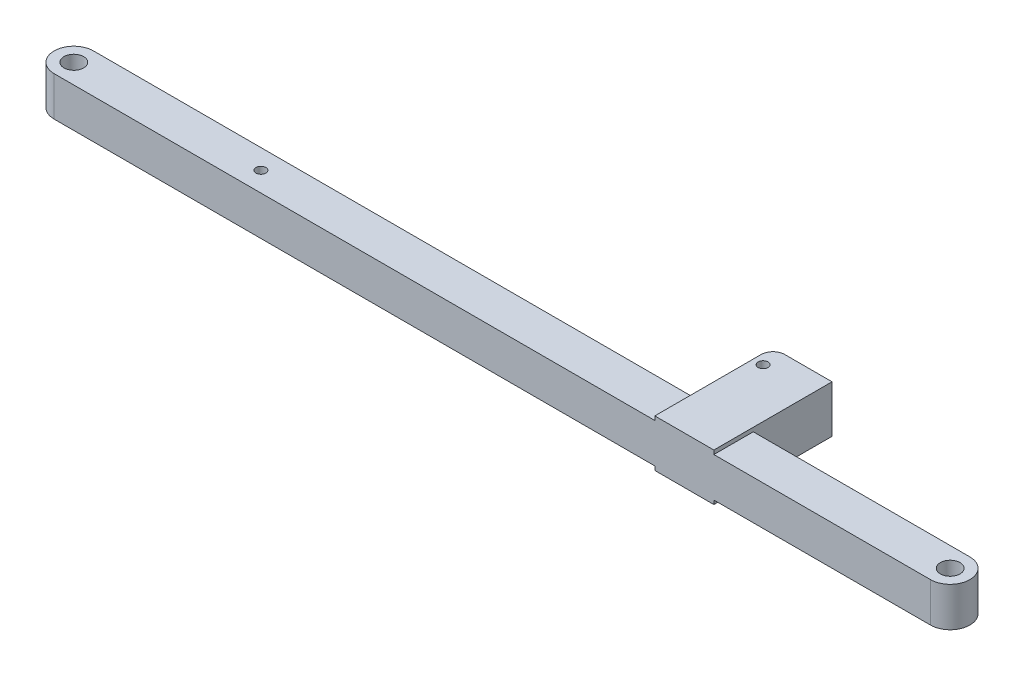
ISO-10303-21;
HEADER;
FILE_DESCRIPTION(('STEP AP214'),'2;1');
FILE_NAME('part.step','',(''),(''),'','','');
FILE_SCHEMA(('AUTOMOTIVE_DESIGN { 1 0 10303 214 1 1 1 1 }'));
ENDSEC;
DATA;
#1=APPLICATION_CONTEXT('core data for automotive mechanical design processes');
#2=APPLICATION_PROTOCOL_DEFINITION('international standard','automotive_design',2000,#1);
#3=PRODUCT_CONTEXT('',#1,'mechanical');
#4=PRODUCT('Part','Part','',(#3));
#5=PRODUCT_RELATED_PRODUCT_CATEGORY('part','',(#4));
#6=PRODUCT_DEFINITION_FORMATION('','',#4);
#7=PRODUCT_DEFINITION_CONTEXT('part definition',#1,'design');
#8=PRODUCT_DEFINITION('design','',#6,#7);
#9=PRODUCT_DEFINITION_SHAPE('','',#8);
#10=(LENGTH_UNIT() NAMED_UNIT(*) SI_UNIT(.MILLI.,.METRE.));
#11=(NAMED_UNIT(*) PLANE_ANGLE_UNIT() SI_UNIT($,.RADIAN.));
#12=(NAMED_UNIT(*) SI_UNIT($,.STERADIAN.) SOLID_ANGLE_UNIT());
#13=UNCERTAINTY_MEASURE_WITH_UNIT(LENGTH_MEASURE(1.E-05),#10,'distance_accuracy_value','');
#14=(GEOMETRIC_REPRESENTATION_CONTEXT(3) GLOBAL_UNCERTAINTY_ASSIGNED_CONTEXT((#13)) GLOBAL_UNIT_ASSIGNED_CONTEXT((#10,
#11,#12)) REPRESENTATION_CONTEXT('',''));
#15=CARTESIAN_POINT('',(0.,0.,0.));
#16=DIRECTION('',(0.,0.,1.));
#17=DIRECTION('',(1.,0.,0.));
#18=AXIS2_PLACEMENT_3D('',#15,#16,#17);
#19=CARTESIAN_POINT('',(0.,-2.53999999999998,0.));
#20=DIRECTION('',(0.,-1.,0.));
#21=DIRECTION('',(0.,0.,-1.));
#22=AXIS2_PLACEMENT_3D('',#19,#20,#21);
#23=PLANE('',#22);
#24=DIRECTION('',(0.,0.,-1.));
#25=VECTOR('',#24,1.);
#26=CARTESIAN_POINT('',(387.35,-2.53999999999998,0.));
#27=LINE('',#26,#25);
#28=CARTESIAN_POINT('',(387.35,-2.53999999999998,0.));
#29=VERTEX_POINT('',#28);
#30=CARTESIAN_POINT('',(387.35,-2.53999999999998,-68.58));
#31=VERTEX_POINT('',#30);
#32=EDGE_CURVE('E243',#29,#31,#27,.T.);
#33=ORIENTED_EDGE('',*,*,#32,.T.);
#34=CARTESIAN_POINT('',(394.97,-2.53999999999998,-68.58));
#35=DIRECTION('',(0.,-1.,0.));
#36=DIRECTION('',(0.,0.,-1.));
#37=AXIS2_PLACEMENT_3D('',#34,#35,#36);
#38=CIRCLE('',#37,7.62);
#39=CARTESIAN_POINT('',(394.97,-2.53999999999998,-76.2));
#40=VERTEX_POINT('',#39);
#41=EDGE_CURVE('E325',#31,#40,#38,.T.);
#42=ORIENTED_EDGE('',*,*,#41,.T.);
#43=DIRECTION('',(-1.,0.,0.));
#44=VECTOR('',#43,1.);
#45=CARTESIAN_POINT('',(0.,-2.53999999999998,-76.2));
#46=LINE('',#45,#44);
#47=CARTESIAN_POINT('',(425.45,-2.53999999999998,-76.2));
#48=VERTEX_POINT('',#47);
#49=EDGE_CURVE('E205',#48,#40,#46,.T.);
#50=ORIENTED_EDGE('',*,*,#49,.F.);
#51=DIRECTION('',(0.,0.,-1.));
#52=VECTOR('',#51,1.);
#53=CARTESIAN_POINT('',(425.45,-2.53999999999998,0.));
#54=LINE('',#53,#52);
#55=CARTESIAN_POINT('',(425.45,-2.53999999999998,0.));
#56=VERTEX_POINT('',#55);
#57=EDGE_CURVE('E236',#56,#48,#54,.T.);
#58=ORIENTED_EDGE('',*,*,#57,.F.);
#59=DIRECTION('',(-1.,0.,0.));
#60=VECTOR('',#59,1.);
#61=CARTESIAN_POINT('',(0.,-2.53999999999998,0.));
#62=LINE('',#61,#60);
#63=EDGE_CURVE('E226',#56,#29,#62,.T.);
#64=ORIENTED_EDGE('',*,*,#63,.T.);
#65=EDGE_LOOP('',(#33,#42,#50,#58,#64));
#66=FACE_BOUND('',#65,.T.);
#67=CARTESIAN_POINT('',(393.7,-2.53999999999998,-63.5));
#68=DIRECTION('',(0.,-1.,0.));
#69=DIRECTION('',(0.,0.,-1.));
#70=AXIS2_PLACEMENT_3D('',#67,#68,#69);
#71=CIRCLE('',#70,3.17499999999997);
#72=CARTESIAN_POINT('',(393.7,-2.53999999999998,-66.675));
#73=VERTEX_POINT('',#72);
#74=EDGE_CURVE('E198',#73,#73,#71,.F.);
#75=ORIENTED_EDGE('',*,*,#74,.T.);
#76=EDGE_LOOP('',(#75));
#77=FACE_BOUND('',#76,.T.);
#78=ADVANCED_FACE('F39',(#66,#77),#23,.T.);
#79=CARTESIAN_POINT('',(0.,27.9400000000001,0.));
#80=DIRECTION('',(0.,1.,0.));
#81=DIRECTION('',(-1.,0.,0.));
#82=AXIS2_PLACEMENT_3D('',#79,#80,#81);
#83=PLANE('',#82);
#84=DIRECTION('',(1.,0.,0.));
#85=VECTOR('',#84,1.);
#86=CARTESIAN_POINT('',(0.,27.9400000000001,-76.2));
#87=LINE('',#86,#85);
#88=CARTESIAN_POINT('',(394.97,27.94,-76.2));
#89=VERTEX_POINT('',#88);
#90=CARTESIAN_POINT('',(425.45,27.94,-76.2));
#91=VERTEX_POINT('',#90);
#92=EDGE_CURVE('E185',#89,#91,#87,.T.);
#93=ORIENTED_EDGE('',*,*,#92,.F.);
#94=CARTESIAN_POINT('',(394.97,27.94,-68.58));
#95=DIRECTION('',(0.,1.,0.));
#96=DIRECTION('',(-1.,0.,0.));
#97=AXIS2_PLACEMENT_3D('',#94,#95,#96);
#98=CIRCLE('',#97,7.62);
#99=CARTESIAN_POINT('',(387.35,27.94,-68.58));
#100=VERTEX_POINT('',#99);
#101=EDGE_CURVE('E61',#89,#100,#98,.T.);
#102=ORIENTED_EDGE('',*,*,#101,.T.);
#103=DIRECTION('',(0.,0.,-1.));
#104=VECTOR('',#103,1.);
#105=CARTESIAN_POINT('',(387.35,27.94,0.));
#106=LINE('',#105,#104);
#107=CARTESIAN_POINT('',(387.35,27.94,0.));
#108=VERTEX_POINT('',#107);
#109=EDGE_CURVE('E241',#108,#100,#106,.T.);
#110=ORIENTED_EDGE('',*,*,#109,.F.);
#111=DIRECTION('',(1.,0.,0.));
#112=VECTOR('',#111,1.);
#113=CARTESIAN_POINT('',(0.,27.9400000000001,0.));
#114=LINE('',#113,#112);
#115=CARTESIAN_POINT('',(425.45,27.94,0.));
#116=VERTEX_POINT('',#115);
#117=EDGE_CURVE('E233',#108,#116,#114,.T.);
#118=ORIENTED_EDGE('',*,*,#117,.T.);
#119=DIRECTION('',(0.,0.,-1.));
#120=VECTOR('',#119,1.);
#121=CARTESIAN_POINT('',(425.45,27.94,0.));
#122=LINE('',#121,#120);
#123=EDGE_CURVE('E237',#116,#91,#122,.T.);
#124=ORIENTED_EDGE('',*,*,#123,.T.);
#125=EDGE_LOOP('',(#93,#102,#110,#118,#124));
#126=FACE_BOUND('',#125,.T.);
#127=CARTESIAN_POINT('',(393.7,27.94,-63.5));
#128=DIRECTION('',(0.,1.,0.));
#129=DIRECTION('',(-1.,0.,0.));
#130=AXIS2_PLACEMENT_3D('',#127,#128,#129);
#131=CIRCLE('',#130,3.17499999999997);
#132=CARTESIAN_POINT('',(390.525,27.94,-63.5));
#133=VERTEX_POINT('',#132);
#134=EDGE_CURVE('E438',#133,#133,#131,.F.);
#135=ORIENTED_EDGE('',*,*,#134,.T.);
#136=EDGE_LOOP('',(#135));
#137=FACE_BOUND('',#136,.T.);
#138=ADVANCED_FACE('F362',(#126,#137),#83,.T.);
#139=CARTESIAN_POINT('',(0.,21.59,-76.2));
#140=DIRECTION('',(0.,1.,0.));
#141=DIRECTION('',(0.,0.,1.));
#142=AXIS2_PLACEMENT_3D('',#139,#140,#141);
#143=PLANE('',#142);
#144=DIRECTION('',(0.,0.,1.));
#145=VECTOR('',#144,1.);
#146=CARTESIAN_POINT('',(387.35,21.59,-76.2));
#147=LINE('',#146,#145);
#148=CARTESIAN_POINT('',(387.35,21.59,-68.58));
#149=VERTEX_POINT('',#148);
#150=CARTESIAN_POINT('',(387.35,21.59,-25.4));
#151=VERTEX_POINT('',#150);
#152=EDGE_CURVE('E175',#149,#151,#147,.T.);
#153=ORIENTED_EDGE('',*,*,#152,.F.);
#154=CARTESIAN_POINT('',(394.97,21.59,-68.58));
#155=DIRECTION('',(0.,1.,0.));
#156=DIRECTION('',(0.,0.,1.));
#157=AXIS2_PLACEMENT_3D('',#154,#155,#156);
#158=CIRCLE('',#157,7.62);
#159=CARTESIAN_POINT('',(394.97,21.59,-76.2));
#160=VERTEX_POINT('',#159);
#161=EDGE_CURVE('E11',#149,#160,#158,.F.);
#162=ORIENTED_EDGE('',*,*,#161,.T.);
#163=DIRECTION('',(-1.,0.,0.));
#164=VECTOR('',#163,1.);
#165=CARTESIAN_POINT('',(0.,21.59,-76.2));
#166=LINE('',#165,#164);
#167=CARTESIAN_POINT('',(419.1,21.59,-76.2));
#168=VERTEX_POINT('',#167);
#169=EDGE_CURVE('E178',#168,#160,#166,.T.);
#170=ORIENTED_EDGE('',*,*,#169,.F.);
#171=DIRECTION('',(0.,0.,1.));
#172=VECTOR('',#171,1.);
#173=CARTESIAN_POINT('',(419.1,21.59,-76.2));
#174=LINE('',#173,#172);
#175=CARTESIAN_POINT('',(419.1,21.59,-25.4));
#176=VERTEX_POINT('',#175);
#177=EDGE_CURVE('E164',#168,#176,#174,.T.);
#178=ORIENTED_EDGE('',*,*,#177,.T.);
#179=DIRECTION('',(-1.,0.,0.));
#180=VECTOR('',#179,1.);
#181=CARTESIAN_POINT('',(0.,21.59,-25.4));
#182=LINE('',#181,#180);
#183=EDGE_CURVE('E210',#176,#151,#182,.T.);
#184=ORIENTED_EDGE('',*,*,#183,.T.);
#185=EDGE_LOOP('',(#153,#162,#170,#178,#184));
#186=FACE_BOUND('',#185,.T.);
#187=CARTESIAN_POINT('',(393.7,21.59,-63.5));
#188=DIRECTION('',(0.,1.,0.));
#189=DIRECTION('',(0.,0.,1.));
#190=AXIS2_PLACEMENT_3D('',#187,#188,#189);
#191=CIRCLE('',#190,3.17499999999997);
#192=CARTESIAN_POINT('',(393.7,21.59,-60.325));
#193=VERTEX_POINT('',#192);
#194=EDGE_CURVE('E317',#193,#193,#191,.F.);
#195=ORIENTED_EDGE('',*,*,#194,.F.);
#196=EDGE_LOOP('',(#195));
#197=FACE_BOUND('',#196,.T.);
#198=ADVANCED_FACE('F179',(#186,#197),#143,.F.);
#199=CARTESIAN_POINT('',(0.,3.81000000000002,-76.2));
#200=DIRECTION('',(0.,1.,0.));
#201=DIRECTION('',(0.,0.,1.));
#202=AXIS2_PLACEMENT_3D('',#199,#200,#201);
#203=PLANE('',#202);
#204=DIRECTION('',(-1.,0.,0.));
#205=VECTOR('',#204,1.);
#206=CARTESIAN_POINT('',(0.,3.81000000000002,-76.2));
#207=LINE('',#206,#205);
#208=CARTESIAN_POINT('',(419.1,3.81000000000002,-76.2));
#209=VERTEX_POINT('',#208);
#210=CARTESIAN_POINT('',(394.97,3.81000000000002,-76.2));
#211=VERTEX_POINT('',#210);
#212=EDGE_CURVE('E191',#209,#211,#207,.T.);
#213=ORIENTED_EDGE('',*,*,#212,.T.);
#214=CARTESIAN_POINT('',(394.97,3.81000000000002,-68.58));
#215=DIRECTION('',(0.,1.,0.));
#216=DIRECTION('',(0.,0.,1.));
#217=AXIS2_PLACEMENT_3D('',#214,#215,#216);
#218=CIRCLE('',#217,7.62);
#219=CARTESIAN_POINT('',(387.35,3.81000000000002,-68.58));
#220=VERTEX_POINT('',#219);
#221=EDGE_CURVE('E321',#211,#220,#218,.T.);
#222=ORIENTED_EDGE('',*,*,#221,.T.);
#223=DIRECTION('',(0.,0.,1.));
#224=VECTOR('',#223,1.);
#225=CARTESIAN_POINT('',(387.35,3.81000000000002,-76.2));
#226=LINE('',#225,#224);
#227=CARTESIAN_POINT('',(387.35,3.81000000000002,-25.4));
#228=VERTEX_POINT('',#227);
#229=EDGE_CURVE('E221',#220,#228,#226,.T.);
#230=ORIENTED_EDGE('',*,*,#229,.T.);
#231=DIRECTION('',(-1.,0.,0.));
#232=VECTOR('',#231,1.);
#233=CARTESIAN_POINT('',(0.,3.81000000000002,-25.4));
#234=LINE('',#233,#232);
#235=CARTESIAN_POINT('',(419.1,3.81000000000002,-25.4));
#236=VERTEX_POINT('',#235);
#237=EDGE_CURVE('E192',#236,#228,#234,.T.);
#238=ORIENTED_EDGE('',*,*,#237,.F.);
#239=DIRECTION('',(0.,0.,1.));
#240=VECTOR('',#239,1.);
#241=CARTESIAN_POINT('',(419.1,3.81000000000002,-76.2));
#242=LINE('',#241,#240);
#243=EDGE_CURVE('E208',#209,#236,#242,.T.);
#244=ORIENTED_EDGE('',*,*,#243,.F.);
#245=EDGE_LOOP('',(#213,#222,#230,#238,#244));
#246=FACE_BOUND('',#245,.T.);
#247=CARTESIAN_POINT('',(393.7,3.81000000000002,-63.5));
#248=DIRECTION('',(0.,1.,0.));
#249=DIRECTION('',(0.,0.,1.));
#250=AXIS2_PLACEMENT_3D('',#247,#248,#249);
#251=CIRCLE('',#250,3.17499999999997);
#252=CARTESIAN_POINT('',(393.7,3.81000000000002,-60.325));
#253=VERTEX_POINT('',#252);
#254=EDGE_CURVE('E314',#253,#253,#251,.F.);
#255=ORIENTED_EDGE('',*,*,#254,.T.);
#256=EDGE_LOOP('',(#255));
#257=FACE_BOUND('',#256,.T.);
#258=ADVANCED_FACE('F339',(#246,#257),#203,.T.);
#259=CARTESIAN_POINT('',(0.,25.4,-25.4));
#260=DIRECTION('',(0.,0.,-1.));
#261=DIRECTION('',(-1.,0.,0.));
#262=AXIS2_PLACEMENT_3D('',#259,#260,#261);
#263=PLANE('',#262);
#264=DIRECTION('',(1.,0.,0.));
#265=VECTOR('',#264,1.);
#266=CARTESIAN_POINT('',(0.,0.,-25.4));
#267=LINE('',#266,#265);
#268=CARTESIAN_POINT('',(425.45,0.,-25.4));
#269=VERTEX_POINT('',#268);
#270=CARTESIAN_POINT('',(565.15,0.,-25.4));
#271=VERTEX_POINT('',#270);
#272=EDGE_CURVE('E279',#269,#271,#267,.T.);
#273=ORIENTED_EDGE('',*,*,#272,.F.);
#274=DIRECTION('',(0.,-1.,0.));
#275=VECTOR('',#274,1.);
#276=CARTESIAN_POINT('',(425.45,0.,-25.4));
#277=LINE('',#276,#275);
#278=CARTESIAN_POINT('',(425.45,25.4,-25.4));
#279=VERTEX_POINT('',#278);
#280=EDGE_CURVE('E215',#279,#269,#277,.T.);
#281=ORIENTED_EDGE('',*,*,#280,.F.);
#282=DIRECTION('',(1.,0.,0.));
#283=VECTOR('',#282,1.);
#284=CARTESIAN_POINT('',(0.,25.4,-25.4));
#285=LINE('',#284,#283);
#286=CARTESIAN_POINT('',(565.15,25.4,-25.4));
#287=VERTEX_POINT('',#286);
#288=EDGE_CURVE('E255',#279,#287,#285,.T.);
#289=ORIENTED_EDGE('',*,*,#288,.T.);
#290=DIRECTION('',(0.,-1.,0.));
#291=VECTOR('',#290,1.);
#292=CARTESIAN_POINT('',(565.15,25.4,-25.4));
#293=LINE('',#292,#291);
#294=EDGE_CURVE('E276',#287,#271,#293,.T.);
#295=ORIENTED_EDGE('',*,*,#294,.T.);
#296=EDGE_LOOP('',(#273,#281,#289,#295));
#297=FACE_BOUND('',#296,.T.);
#298=ADVANCED_FACE('F425',(#297),#263,.T.);
#299=CARTESIAN_POINT('',(0.,25.4,-25.4));
#300=VERTEX_POINT('',#299);
#301=CARTESIAN_POINT('',(387.35,25.4,-25.4));
#302=VERTEX_POINT('',#301);
#303=EDGE_CURVE('E257',#300,#302,#285,.T.);
#304=ORIENTED_EDGE('',*,*,#303,.T.);
#305=DIRECTION('',(0.,1.,0.));
#306=VECTOR('',#305,1.);
#307=CARTESIAN_POINT('',(387.35,0.,-25.4));
#308=LINE('',#307,#306);
#309=EDGE_CURVE('E212',#151,#302,#308,.T.);
#310=ORIENTED_EDGE('',*,*,#309,.F.);
#311=ORIENTED_EDGE('',*,*,#183,.F.);
#312=DIRECTION('',(0.,-1.,0.));
#313=VECTOR('',#312,1.);
#314=CARTESIAN_POINT('',(419.1,0.,-25.4));
#315=LINE('',#314,#313);
#316=EDGE_CURVE('E171',#176,#236,#315,.T.);
#317=ORIENTED_EDGE('',*,*,#316,.T.);
#318=ORIENTED_EDGE('',*,*,#237,.T.);
#319=DIRECTION('',(0.,1.,0.));
#320=VECTOR('',#319,1.);
#321=CARTESIAN_POINT('',(387.35,0.,-25.4));
#322=LINE('',#321,#320);
#323=CARTESIAN_POINT('',(387.35,0.,-25.4));
#324=VERTEX_POINT('',#323);
#325=EDGE_CURVE('E195',#324,#228,#322,.T.);
#326=ORIENTED_EDGE('',*,*,#325,.F.);
#327=CARTESIAN_POINT('',(0.,0.,-25.4));
#328=VERTEX_POINT('',#327);
#329=EDGE_CURVE('E280',#328,#324,#267,.T.);
#330=ORIENTED_EDGE('',*,*,#329,.F.);
#331=DIRECTION('',(0.,-1.,0.));
#332=VECTOR('',#331,1.);
#333=CARTESIAN_POINT('',(0.,25.4,-25.4));
#334=LINE('',#333,#332);
#335=EDGE_CURVE('E306',#300,#328,#334,.T.);
#336=ORIENTED_EDGE('',*,*,#335,.F.);
#337=EDGE_LOOP('',(#304,#310,#311,#317,#318,#326,#330,#336));
#338=FACE_BOUND('',#337,.T.);
#339=ADVANCED_FACE('F347',(#338),#263,.T.);
#340=CARTESIAN_POINT('',(0.,25.4,0.));
#341=DIRECTION('',(0.,1.,0.));
#342=DIRECTION('',(0.,0.,1.));
#343=AXIS2_PLACEMENT_3D('',#340,#341,#342);
#344=PLANE('',#343);
#345=DIRECTION('',(0.,0.,-1.));
#346=VECTOR('',#345,1.);
#347=CARTESIAN_POINT('',(425.45,25.4,0.));
#348=LINE('',#347,#346);
#349=CARTESIAN_POINT('',(425.45,25.4,0.));
#350=VERTEX_POINT('',#349);
#351=EDGE_CURVE('E248',#350,#279,#348,.T.);
#352=ORIENTED_EDGE('',*,*,#351,.F.);
#353=DIRECTION('',(1.,0.,0.));
#354=VECTOR('',#353,1.);
#355=CARTESIAN_POINT('',(0.,25.4,0.));
#356=LINE('',#355,#354);
#357=CARTESIAN_POINT('',(565.15,25.4,0.));
#358=VERTEX_POINT('',#357);
#359=EDGE_CURVE('E263',#350,#358,#356,.T.);
#360=ORIENTED_EDGE('',*,*,#359,.T.);
#361=CARTESIAN_POINT('',(565.15,25.4,-12.7));
#362=DIRECTION('',(0.,1.,0.));
#363=DIRECTION('',(0.,0.,1.));
#364=AXIS2_PLACEMENT_3D('',#361,#362,#363);
#365=CIRCLE('',#364,12.7);
#366=EDGE_CURVE('E267',#287,#358,#365,.F.);
#367=ORIENTED_EDGE('',*,*,#366,.F.);
#368=ORIENTED_EDGE('',*,*,#288,.F.);
#369=EDGE_LOOP('',(#352,#360,#367,#368));
#370=FACE_BOUND('',#369,.T.);
#371=CARTESIAN_POINT('',(565.15,25.4,-12.7));
#372=DIRECTION('',(0.,1.,0.));
#373=DIRECTION('',(0.,0.,1.));
#374=AXIS2_PLACEMENT_3D('',#371,#372,#373);
#375=CIRCLE('',#374,6.34999999999994);
#376=CARTESIAN_POINT('',(565.15,25.4,-6.35000000000006));
#377=VERTEX_POINT('',#376);
#378=EDGE_CURVE('E273',#377,#377,#375,.T.);
#379=ORIENTED_EDGE('',*,*,#378,.F.);
#380=EDGE_LOOP('',(#379));
#381=FACE_BOUND('',#380,.T.);
#382=ADVANCED_FACE('F379',(#370,#381),#344,.T.);
#383=CARTESIAN_POINT('',(0.,0.,0.));
#384=DIRECTION('',(0.,1.,0.));
#385=DIRECTION('',(0.,0.,1.));
#386=AXIS2_PLACEMENT_3D('',#383,#384,#385);
#387=PLANE('',#386);
#388=CARTESIAN_POINT('',(565.15,0.,-12.7));
#389=DIRECTION('',(0.,1.,0.));
#390=DIRECTION('',(0.,0.,1.));
#391=AXIS2_PLACEMENT_3D('',#388,#389,#390);
#392=CIRCLE('',#391,6.34999999999994);
#393=CARTESIAN_POINT('',(565.15,0.,-6.35000000000006));
#394=VERTEX_POINT('',#393);
#395=EDGE_CURVE('E256',#394,#394,#392,.T.);
#396=ORIENTED_EDGE('',*,*,#395,.T.);
#397=EDGE_LOOP('',(#396));
#398=FACE_BOUND('',#397,.T.);
#399=DIRECTION('',(1.,0.,0.));
#400=VECTOR('',#399,1.);
#401=CARTESIAN_POINT('',(0.,0.,0.));
#402=LINE('',#401,#400);
#403=CARTESIAN_POINT('',(425.45,0.,0.));
#404=VERTEX_POINT('',#403);
#405=CARTESIAN_POINT('',(565.15,0.,0.));
#406=VERTEX_POINT('',#405);
#407=EDGE_CURVE('E286',#404,#406,#402,.T.);
#408=ORIENTED_EDGE('',*,*,#407,.F.);
#409=DIRECTION('',(0.,0.,-1.));
#410=VECTOR('',#409,1.);
#411=CARTESIAN_POINT('',(425.45,0.,0.));
#412=LINE('',#411,#410);
#413=EDGE_CURVE('E310',#404,#269,#412,.T.);
#414=ORIENTED_EDGE('',*,*,#413,.T.);
#415=ORIENTED_EDGE('',*,*,#272,.T.);
#416=CARTESIAN_POINT('',(565.15,0.,-12.7));
#417=DIRECTION('',(0.,1.,0.));
#418=DIRECTION('',(0.,0.,1.));
#419=AXIS2_PLACEMENT_3D('',#416,#417,#418);
#420=CIRCLE('',#419,12.7);
#421=EDGE_CURVE('E290',#271,#406,#420,.F.);
#422=ORIENTED_EDGE('',*,*,#421,.T.);
#423=EDGE_LOOP('',(#408,#414,#415,#422));
#424=FACE_BOUND('',#423,.T.);
#425=ADVANCED_FACE('F393',(#398,#424),#387,.F.);
#426=CARTESIAN_POINT('',(0.,25.4,-12.7));
#427=DIRECTION('',(0.,-1.,0.));
#428=DIRECTION('',(0.,0.,-1.));
#429=AXIS2_PLACEMENT_3D('',#426,#427,#428);
#430=CYLINDRICAL_SURFACE('',#429,12.7);
#431=CARTESIAN_POINT('',(0.,0.,-12.7));
#432=DIRECTION('',(0.,1.,0.));
#433=DIRECTION('',(0.,0.,1.));
#434=AXIS2_PLACEMENT_3D('',#431,#432,#433);
#435=CIRCLE('',#434,12.7);
#436=CARTESIAN_POINT('',(0.,0.,0.));
#437=VERTEX_POINT('',#436);
#438=EDGE_CURVE('E283',#328,#437,#435,.T.);
#439=ORIENTED_EDGE('',*,*,#438,.T.);
#440=DIRECTION('',(0.,-1.,0.));
#441=VECTOR('',#440,1.);
#442=CARTESIAN_POINT('',(0.,25.4,0.));
#443=LINE('',#442,#441);
#444=CARTESIAN_POINT('',(0.,25.4,0.));
#445=VERTEX_POINT('',#444);
#446=EDGE_CURVE('E303',#445,#437,#443,.T.);
#447=ORIENTED_EDGE('',*,*,#446,.F.);
#448=CARTESIAN_POINT('',(0.,25.4,-12.7));
#449=DIRECTION('',(0.,1.,0.));
#450=DIRECTION('',(0.,0.,1.));
#451=AXIS2_PLACEMENT_3D('',#448,#449,#450);
#452=CIRCLE('',#451,12.7);
#453=EDGE_CURVE('E260',#300,#445,#452,.T.);
#454=ORIENTED_EDGE('',*,*,#453,.F.);
#455=ORIENTED_EDGE('',*,*,#335,.T.);
#456=EDGE_LOOP('',(#439,#447,#454,#455));
#457=FACE_BOUND('',#456,.T.);
#458=ADVANCED_FACE('F354',(#457),#430,.T.);
#459=CARTESIAN_POINT('',(0.,25.4,0.));
#460=DIRECTION('',(0.,0.,-1.));
#461=DIRECTION('',(-1.,0.,0.));
#462=AXIS2_PLACEMENT_3D('',#459,#460,#461);
#463=PLANE('',#462);
#464=CARTESIAN_POINT('',(387.35,0.,0.));
#465=VERTEX_POINT('',#464);
#466=EDGE_CURVE('E287',#437,#465,#402,.T.);
#467=ORIENTED_EDGE('',*,*,#466,.T.);
#468=DIRECTION('',(0.,1.,0.));
#469=VECTOR('',#468,1.);
#470=CARTESIAN_POINT('',(387.35,0.,0.));
#471=LINE('',#470,#469);
#472=EDGE_CURVE('E230',#29,#465,#471,.T.);
#473=ORIENTED_EDGE('',*,*,#472,.F.);
#474=ORIENTED_EDGE('',*,*,#63,.F.);
#475=DIRECTION('',(0.,-1.,0.));
#476=VECTOR('',#475,1.);
#477=CARTESIAN_POINT('',(425.45,0.,0.));
#478=LINE('',#477,#476);
#479=EDGE_CURVE('E174',#404,#56,#478,.T.);
#480=ORIENTED_EDGE('',*,*,#479,.F.);
#481=ORIENTED_EDGE('',*,*,#407,.T.);
#482=DIRECTION('',(0.,-1.,0.));
#483=VECTOR('',#482,1.);
#484=CARTESIAN_POINT('',(565.15,25.4,0.));
#485=LINE('',#484,#483);
#486=EDGE_CURVE('E300',#358,#406,#485,.T.);
#487=ORIENTED_EDGE('',*,*,#486,.F.);
#488=ORIENTED_EDGE('',*,*,#359,.F.);
#489=EDGE_CURVE('E224',#116,#350,#478,.T.);
#490=ORIENTED_EDGE('',*,*,#489,.F.);
#491=ORIENTED_EDGE('',*,*,#117,.F.);
#492=CARTESIAN_POINT('',(387.35,25.4,0.));
#493=VERTEX_POINT('',#492);
#494=EDGE_CURVE('E229',#493,#108,#471,.T.);
#495=ORIENTED_EDGE('',*,*,#494,.F.);
#496=EDGE_CURVE('E264',#445,#493,#356,.T.);
#497=ORIENTED_EDGE('',*,*,#496,.F.);
#498=ORIENTED_EDGE('',*,*,#446,.T.);
#499=EDGE_LOOP('',(#467,#473,#474,#480,#481,#487,#488,#490,#491,#495,#497,#498));
#500=FACE_BOUND('',#499,.T.);
#501=ADVANCED_FACE('F373',(#500),#463,.F.);
#502=CARTESIAN_POINT('',(120.65,25.4,-12.7));
#503=DIRECTION('',(0.,-1.,0.));
#504=DIRECTION('',(0.,0.,-1.));
#505=AXIS2_PLACEMENT_3D('',#502,#503,#504);
#506=CYLINDRICAL_SURFACE('',#505,3.175);
#507=CARTESIAN_POINT('',(120.65,25.4,-12.7));
#508=DIRECTION('',(0.,1.,0.));
#509=DIRECTION('',(0.,0.,1.));
#510=AXIS2_PLACEMENT_3D('',#507,#508,#509);
#511=CIRCLE('',#510,3.175);
#512=CARTESIAN_POINT('',(120.65,25.4,-9.525));
#513=VERTEX_POINT('',#512);
#514=EDGE_CURVE('E270',#513,#513,#511,.T.);
#515=ORIENTED_EDGE('',*,*,#514,.T.);
#516=EDGE_LOOP('',(#515));
#517=FACE_BOUND('',#516,.T.);
#518=CARTESIAN_POINT('',(120.65,0.,-12.7));
#519=DIRECTION('',(0.,1.,0.));
#520=DIRECTION('',(0.,0.,1.));
#521=AXIS2_PLACEMENT_3D('',#518,#519,#520);
#522=CIRCLE('',#521,3.175);
#523=CARTESIAN_POINT('',(120.65,0.,-9.525));
#524=VERTEX_POINT('',#523);
#525=EDGE_CURVE('E293',#524,#524,#522,.T.);
#526=ORIENTED_EDGE('',*,*,#525,.F.);
#527=EDGE_LOOP('',(#526));
#528=FACE_BOUND('',#527,.T.);
#529=ADVANCED_FACE('F384',(#517,#528),#506,.F.);
#530=CARTESIAN_POINT('',(565.15,25.4,-12.7));
#531=DIRECTION('',(0.,-1.,0.));
#532=DIRECTION('',(0.,0.,-1.));
#533=AXIS2_PLACEMENT_3D('',#530,#531,#532);
#534=CYLINDRICAL_SURFACE('',#533,12.7);
#535=ORIENTED_EDGE('',*,*,#421,.F.);
#536=ORIENTED_EDGE('',*,*,#294,.F.);
#537=ORIENTED_EDGE('',*,*,#366,.T.);
#538=ORIENTED_EDGE('',*,*,#486,.T.);
#539=EDGE_LOOP('',(#535,#536,#537,#538));
#540=FACE_BOUND('',#539,.T.);
#541=ADVANCED_FACE('F387',(#540),#534,.T.);
#542=CARTESIAN_POINT('',(0.,25.4,-12.7));
#543=DIRECTION('',(0.,-1.,0.));
#544=DIRECTION('',(0.,0.,-1.));
#545=AXIS2_PLACEMENT_3D('',#542,#543,#544);
#546=CYLINDRICAL_SURFACE('',#545,6.35);
#547=CARTESIAN_POINT('',(0.,25.4,-12.7));
#548=DIRECTION('',(0.,1.,0.));
#549=DIRECTION('',(0.,0.,1.));
#550=AXIS2_PLACEMENT_3D('',#547,#548,#549);
#551=CIRCLE('',#550,6.35);
#552=CARTESIAN_POINT('',(0.,25.4,-6.35));
#553=VERTEX_POINT('',#552);
#554=EDGE_CURVE('E252',#553,#553,#551,.T.);
#555=ORIENTED_EDGE('',*,*,#554,.T.);
#556=EDGE_LOOP('',(#555));
#557=FACE_BOUND('',#556,.T.);
#558=CARTESIAN_POINT('',(0.,0.,-12.7));
#559=DIRECTION('',(0.,1.,0.));
#560=DIRECTION('',(0.,0.,1.));
#561=AXIS2_PLACEMENT_3D('',#558,#559,#560);
#562=CIRCLE('',#561,6.35);
#563=CARTESIAN_POINT('',(0.,0.,-6.35));
#564=VERTEX_POINT('',#563);
#565=EDGE_CURVE('E251',#564,#564,#562,.T.);
#566=ORIENTED_EDGE('',*,*,#565,.F.);
#567=EDGE_LOOP('',(#566));
#568=FACE_BOUND('',#567,.T.);
#569=ADVANCED_FACE('F452',(#557,#568),#546,.F.);
#570=CARTESIAN_POINT('',(565.15,25.4,-12.7));
#571=DIRECTION('',(0.,-1.,0.));
#572=DIRECTION('',(0.,0.,-1.));
#573=AXIS2_PLACEMENT_3D('',#570,#571,#572);
#574=CYLINDRICAL_SURFACE('',#573,6.34999999999994);
#575=ORIENTED_EDGE('',*,*,#378,.T.);
#576=EDGE_LOOP('',(#575));
#577=FACE_BOUND('',#576,.T.);
#578=ORIENTED_EDGE('',*,*,#395,.F.);
#579=EDGE_LOOP('',(#578));
#580=FACE_BOUND('',#579,.T.);
#581=ADVANCED_FACE('F377',(#577,#580),#574,.F.);
#582=DIRECTION('',(0.,0.,1.));
#583=VECTOR('',#582,1.);
#584=CARTESIAN_POINT('',(387.35,25.4,0.));
#585=LINE('',#584,#583);
#586=EDGE_CURVE('E240',#302,#493,#585,.T.);
#587=ORIENTED_EDGE('',*,*,#586,.F.);
#588=ORIENTED_EDGE('',*,*,#303,.F.);
#589=ORIENTED_EDGE('',*,*,#453,.T.);
#590=ORIENTED_EDGE('',*,*,#496,.T.);
#591=EDGE_LOOP('',(#587,#588,#589,#590));
#592=FACE_BOUND('',#591,.T.);
#593=ORIENTED_EDGE('',*,*,#554,.F.);
#594=EDGE_LOOP('',(#593));
#595=FACE_BOUND('',#594,.T.);
#596=ORIENTED_EDGE('',*,*,#514,.F.);
#597=EDGE_LOOP('',(#596));
#598=FACE_BOUND('',#597,.T.);
#599=ADVANCED_FACE('F374',(#592,#595,#598),#344,.T.);
#600=ORIENTED_EDGE('',*,*,#565,.T.);
#601=EDGE_LOOP('',(#600));
#602=FACE_BOUND('',#601,.T.);
#603=ORIENTED_EDGE('',*,*,#329,.T.);
#604=DIRECTION('',(0.,0.,1.));
#605=VECTOR('',#604,1.);
#606=CARTESIAN_POINT('',(387.35,0.,0.));
#607=LINE('',#606,#605);
#608=EDGE_CURVE('E308',#324,#465,#607,.T.);
#609=ORIENTED_EDGE('',*,*,#608,.T.);
#610=ORIENTED_EDGE('',*,*,#466,.F.);
#611=ORIENTED_EDGE('',*,*,#438,.F.);
#612=EDGE_LOOP('',(#603,#609,#610,#611));
#613=FACE_BOUND('',#612,.T.);
#614=ORIENTED_EDGE('',*,*,#525,.T.);
#615=EDGE_LOOP('',(#614));
#616=FACE_BOUND('',#615,.T.);
#617=ADVANCED_FACE('F350',(#602,#613,#616),#387,.F.);
#618=CARTESIAN_POINT('',(387.35,0.,0.));
#619=DIRECTION('',(-1.,0.,0.));
#620=DIRECTION('',(0.,0.,1.));
#621=AXIS2_PLACEMENT_3D('',#618,#619,#620);
#622=PLANE('',#621);
#623=ORIENTED_EDGE('',*,*,#229,.F.);
#624=DIRECTION('',(0.,1.,0.));
#625=VECTOR('',#624,1.);
#626=CARTESIAN_POINT('',(387.35,0.,-68.58));
#627=LINE('',#626,#625);
#628=EDGE_CURVE('E323',#220,#31,#627,.F.);
#629=ORIENTED_EDGE('',*,*,#628,.T.);
#630=ORIENTED_EDGE('',*,*,#32,.F.);
#631=ORIENTED_EDGE('',*,*,#472,.T.);
#632=ORIENTED_EDGE('',*,*,#608,.F.);
#633=ORIENTED_EDGE('',*,*,#325,.T.);
#634=EDGE_LOOP('',(#623,#629,#630,#631,#632,#633));
#635=FACE_BOUND('',#634,.T.);
#636=ADVANCED_FACE('F343',(#635),#622,.T.);
#637=CARTESIAN_POINT('',(425.45,0.,0.));
#638=DIRECTION('',(1.,0.,0.));
#639=DIRECTION('',(0.,0.,-1.));
#640=AXIS2_PLACEMENT_3D('',#637,#638,#639);
#641=PLANE('',#640);
#642=ORIENTED_EDGE('',*,*,#413,.F.);
#643=ORIENTED_EDGE('',*,*,#479,.T.);
#644=ORIENTED_EDGE('',*,*,#57,.T.);
#645=DIRECTION('',(0.,-1.,0.));
#646=VECTOR('',#645,1.);
#647=CARTESIAN_POINT('',(425.45,0.,-76.2));
#648=LINE('',#647,#646);
#649=EDGE_CURVE('E202',#91,#48,#648,.T.);
#650=ORIENTED_EDGE('',*,*,#649,.F.);
#651=ORIENTED_EDGE('',*,*,#123,.F.);
#652=ORIENTED_EDGE('',*,*,#489,.T.);
#653=ORIENTED_EDGE('',*,*,#351,.T.);
#654=ORIENTED_EDGE('',*,*,#280,.T.);
#655=EDGE_LOOP('',(#642,#643,#644,#650,#651,#652,#653,#654));
#656=FACE_BOUND('',#655,.T.);
#657=ADVANCED_FACE('F368',(#656),#641,.T.);
#658=ORIENTED_EDGE('',*,*,#109,.T.);
#659=DIRECTION('',(0.,1.,0.));
#660=VECTOR('',#659,1.);
#661=CARTESIAN_POINT('',(387.35,0.,-68.58));
#662=LINE('',#661,#660);
#663=EDGE_CURVE('E47',#100,#149,#662,.F.);
#664=ORIENTED_EDGE('',*,*,#663,.T.);
#665=ORIENTED_EDGE('',*,*,#152,.T.);
#666=ORIENTED_EDGE('',*,*,#309,.T.);
#667=ORIENTED_EDGE('',*,*,#586,.T.);
#668=ORIENTED_EDGE('',*,*,#494,.T.);
#669=EDGE_LOOP('',(#658,#664,#665,#666,#667,#668));
#670=FACE_BOUND('',#669,.T.);
#671=ADVANCED_FACE('F359',(#670),#622,.T.);
#672=CARTESIAN_POINT('',(419.1,0.,-76.2));
#673=DIRECTION('',(-1.,0.,0.));
#674=DIRECTION('',(0.,0.,1.));
#675=AXIS2_PLACEMENT_3D('',#672,#673,#674);
#676=PLANE('',#675);
#677=ORIENTED_EDGE('',*,*,#316,.F.);
#678=ORIENTED_EDGE('',*,*,#177,.F.);
#679=DIRECTION('',(0.,-1.,0.));
#680=VECTOR('',#679,1.);
#681=CARTESIAN_POINT('',(419.1,0.,-76.2));
#682=LINE('',#681,#680);
#683=EDGE_CURVE('E169',#168,#209,#682,.T.);
#684=ORIENTED_EDGE('',*,*,#683,.T.);
#685=ORIENTED_EDGE('',*,*,#243,.T.);
#686=EDGE_LOOP('',(#677,#678,#684,#685));
#687=FACE_BOUND('',#686,.T.);
#688=ADVANCED_FACE('F166',(#687),#676,.T.);
#689=CARTESIAN_POINT('',(0.,0.,-76.2));
#690=DIRECTION('',(0.,0.,-1.));
#691=DIRECTION('',(-1.,0.,0.));
#692=AXIS2_PLACEMENT_3D('',#689,#690,#691);
#693=PLANE('',#692);
#694=ORIENTED_EDGE('',*,*,#49,.T.);
#695=DIRECTION('',(0.,1.,0.));
#696=VECTOR('',#695,1.);
#697=CARTESIAN_POINT('',(394.97,0.,-76.2));
#698=LINE('',#697,#696);
#699=EDGE_CURVE('E319',#40,#211,#698,.T.);
#700=ORIENTED_EDGE('',*,*,#699,.T.);
#701=ORIENTED_EDGE('',*,*,#212,.F.);
#702=ORIENTED_EDGE('',*,*,#683,.F.);
#703=ORIENTED_EDGE('',*,*,#169,.T.);
#704=DIRECTION('',(0.,1.,0.));
#705=VECTOR('',#704,1.);
#706=CARTESIAN_POINT('',(394.97,0.,-76.2));
#707=LINE('',#706,#705);
#708=EDGE_CURVE('E313',#160,#89,#707,.T.);
#709=ORIENTED_EDGE('',*,*,#708,.T.);
#710=ORIENTED_EDGE('',*,*,#92,.T.);
#711=ORIENTED_EDGE('',*,*,#649,.T.);
#712=EDGE_LOOP('',(#694,#700,#701,#702,#703,#709,#710,#711));
#713=FACE_BOUND('',#712,.T.);
#714=ADVANCED_FACE('F188',(#713),#693,.T.);
#715=CARTESIAN_POINT('',(393.7,-18.034,-63.5));
#716=DIRECTION('',(0.,1.,0.));
#717=DIRECTION('',(0.,0.,1.));
#718=AXIS2_PLACEMENT_3D('',#715,#716,#717);
#719=CYLINDRICAL_SURFACE('',#718,3.17499999999997);
#720=ORIENTED_EDGE('',*,*,#74,.F.);
#721=EDGE_LOOP('',(#720));
#722=FACE_BOUND('',#721,.T.);
#723=ORIENTED_EDGE('',*,*,#254,.F.);
#724=EDGE_LOOP('',(#723));
#725=FACE_BOUND('',#724,.T.);
#726=ADVANCED_FACE('F419',(#722,#725),#719,.F.);
#727=ORIENTED_EDGE('',*,*,#134,.F.);
#728=EDGE_LOOP('',(#727));
#729=FACE_BOUND('',#728,.T.);
#730=ORIENTED_EDGE('',*,*,#194,.T.);
#731=EDGE_LOOP('',(#730));
#732=FACE_BOUND('',#731,.T.);
#733=ADVANCED_FACE('F428',(#729,#732),#719,.F.);
#734=CARTESIAN_POINT('',(394.97,0.,-68.58));
#735=DIRECTION('',(0.,1.,0.));
#736=DIRECTION('',(0.,0.,1.));
#737=AXIS2_PLACEMENT_3D('',#734,#735,#736);
#738=CYLINDRICAL_SURFACE('',#737,7.62);
#739=ORIENTED_EDGE('',*,*,#41,.F.);
#740=ORIENTED_EDGE('',*,*,#628,.F.);
#741=ORIENTED_EDGE('',*,*,#221,.F.);
#742=ORIENTED_EDGE('',*,*,#699,.F.);
#743=EDGE_LOOP('',(#739,#740,#741,#742));
#744=FACE_BOUND('',#743,.T.);
#745=ADVANCED_FACE('F336',(#744),#738,.T.);
#746=CARTESIAN_POINT('',(394.97,0.,-68.58));
#747=DIRECTION('',(0.,1.,0.));
#748=DIRECTION('',(0.,0.,1.));
#749=AXIS2_PLACEMENT_3D('',#746,#747,#748);
#750=CYLINDRICAL_SURFACE('',#749,7.62);
#751=ORIENTED_EDGE('',*,*,#161,.F.);
#752=ORIENTED_EDGE('',*,*,#663,.F.);
#753=ORIENTED_EDGE('',*,*,#101,.F.);
#754=ORIENTED_EDGE('',*,*,#708,.F.);
#755=EDGE_LOOP('',(#751,#752,#753,#754));
#756=FACE_BOUND('',#755,.T.);
#757=ADVANCED_FACE('F41',(#756),#750,.T.);
#758=CLOSED_SHELL('',(#78,#138,#198,#258,#298,#339,#382,#425,#458,#501,#529,#541,#569,#581,#599,
#617,#636,#657,#671,#688,#714,#726,#733,#745,#757));
#759=MANIFOLD_SOLID_BREP('B2',#758);
#760=ADVANCED_BREP_SHAPE_REPRESENTATION('',(#18,#759),#14);
#761=SHAPE_DEFINITION_REPRESENTATION(#9,#760);
ENDSEC;
END-ISO-10303-21;
